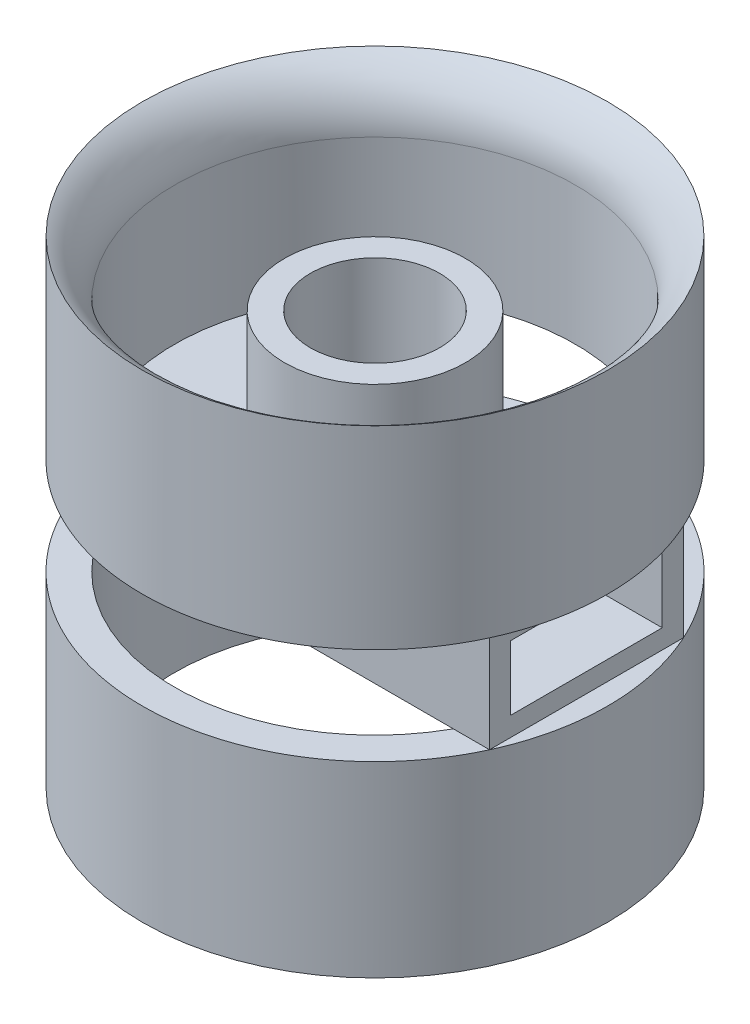
ISO-10303-21;
HEADER;
FILE_DESCRIPTION(('STEP AP214'),'2;1');
FILE_NAME('part.step','',(''),(''),'','','');
FILE_SCHEMA(('AUTOMOTIVE_DESIGN { 1 0 10303 214 1 1 1 1 }'));
ENDSEC;
DATA;
#1=APPLICATION_CONTEXT('core data for automotive mechanical design processes');
#2=APPLICATION_PROTOCOL_DEFINITION('international standard','automotive_design',2000,#1);
#3=PRODUCT_CONTEXT('',#1,'mechanical');
#4=PRODUCT('Part','Part','',(#3));
#5=PRODUCT_RELATED_PRODUCT_CATEGORY('part','',(#4));
#6=PRODUCT_DEFINITION_FORMATION('','',#4);
#7=PRODUCT_DEFINITION_CONTEXT('part definition',#1,'design');
#8=PRODUCT_DEFINITION('design','',#6,#7);
#9=PRODUCT_DEFINITION_SHAPE('','',#8);
#10=(LENGTH_UNIT() NAMED_UNIT(*) SI_UNIT(.MILLI.,.METRE.));
#11=(NAMED_UNIT(*) PLANE_ANGLE_UNIT() SI_UNIT($,.RADIAN.));
#12=(NAMED_UNIT(*) SI_UNIT($,.STERADIAN.) SOLID_ANGLE_UNIT());
#13=UNCERTAINTY_MEASURE_WITH_UNIT(LENGTH_MEASURE(1.E-05),#10,'distance_accuracy_value','');
#14=(GEOMETRIC_REPRESENTATION_CONTEXT(3) GLOBAL_UNCERTAINTY_ASSIGNED_CONTEXT((#13)) GLOBAL_UNIT_ASSIGNED_CONTEXT((#10,
#11,#12)) REPRESENTATION_CONTEXT('',''));
#15=CARTESIAN_POINT('',(0.,0.,0.));
#16=DIRECTION('',(0.,0.,1.));
#17=DIRECTION('',(1.,0.,0.));
#18=AXIS2_PLACEMENT_3D('',#15,#16,#17);
#19=CARTESIAN_POINT('',(0.,30.,0.));
#20=DIRECTION('',(0.,-1.,0.));
#21=DIRECTION('',(0.,0.,-1.));
#22=AXIS2_PLACEMENT_3D('',#19,#20,#21);
#23=CYLINDRICAL_SURFACE('',#22,36.);
#24=CARTESIAN_POINT('',(0.,30.,0.));
#25=DIRECTION('',(0.,1.,0.));
#26=DIRECTION('',(0.,0.,1.));
#27=AXIS2_PLACEMENT_3D('',#24,#25,#26);
#28=CIRCLE('',#27,36.);
#29=CARTESIAN_POINT('',(0.,30.,36.));
#30=VERTEX_POINT('',#29);
#31=EDGE_CURVE('E228',#30,#30,#28,.T.);
#32=ORIENTED_EDGE('',*,*,#31,.F.);
#33=EDGE_LOOP('',(#32));
#34=FACE_BOUND('',#33,.T.);
#35=CARTESIAN_POINT('',(0.,0.,0.));
#36=DIRECTION('',(0.,1.,0.));
#37=DIRECTION('',(0.,0.,1.));
#38=AXIS2_PLACEMENT_3D('',#35,#36,#37);
#39=CIRCLE('',#38,36.);
#40=CARTESIAN_POINT('',(0.,0.,36.));
#41=VERTEX_POINT('',#40);
#42=EDGE_CURVE('E226',#41,#41,#39,.T.);
#43=ORIENTED_EDGE('',*,*,#42,.T.);
#44=EDGE_LOOP('',(#43));
#45=FACE_BOUND('',#44,.T.);
#46=ADVANCED_FACE('F33',(#34,#45),#23,.T.);
#47=CARTESIAN_POINT('',(0.,0.,0.));
#48=DIRECTION('',(0.,1.,0.));
#49=DIRECTION('',(0.,0.,1.));
#50=AXIS2_PLACEMENT_3D('',#47,#48,#49);
#51=PLANE('',#50);
#52=CARTESIAN_POINT('',(0.,0.,0.));
#53=DIRECTION('',(0.,1.,0.));
#54=DIRECTION('',(0.,0.,1.));
#55=AXIS2_PLACEMENT_3D('',#52,#53,#54);
#56=CIRCLE('',#55,31.);
#57=CARTESIAN_POINT('',(27.1293199325011,0.,-15.));
#58=VERTEX_POINT('',#57);
#59=CARTESIAN_POINT('',(-27.1293199325011,0.,-15.));
#60=VERTEX_POINT('',#59);
#61=EDGE_CURVE('E227',#58,#60,#56,.T.);
#62=ORIENTED_EDGE('',*,*,#61,.T.);
#63=DIRECTION('',(-1.,0.,0.));
#64=VECTOR('',#63,1.);
#65=CARTESIAN_POINT('',(-32.7237421934683,0.,-15.));
#66=LINE('',#65,#64);
#67=CARTESIAN_POINT('',(-32.7237421934683,0.,-15.));
#68=VERTEX_POINT('',#67);
#69=EDGE_CURVE('E208',#60,#68,#66,.T.);
#70=ORIENTED_EDGE('',*,*,#69,.T.);
#71=DIRECTION('',(0.,0.,1.));
#72=VECTOR('',#71,1.);
#73=CARTESIAN_POINT('',(-32.7237421934683,0.,-15.));
#74=LINE('',#73,#72);
#75=CARTESIAN_POINT('',(-32.7237421934683,0.,15.));
#76=VERTEX_POINT('',#75);
#77=EDGE_CURVE('E207',#68,#76,#74,.T.);
#78=ORIENTED_EDGE('',*,*,#77,.T.);
#79=DIRECTION('',(1.,0.,0.));
#80=VECTOR('',#79,1.);
#81=CARTESIAN_POINT('',(-32.7237421934683,0.,15.));
#82=LINE('',#81,#80);
#83=CARTESIAN_POINT('',(-27.1293199325011,0.,15.));
#84=VERTEX_POINT('',#83);
#85=EDGE_CURVE('E212',#76,#84,#82,.T.);
#86=ORIENTED_EDGE('',*,*,#85,.T.);
#87=CARTESIAN_POINT('',(27.1293199325011,0.,15.));
#88=VERTEX_POINT('',#87);
#89=EDGE_CURVE('E218',#84,#88,#56,.T.);
#90=ORIENTED_EDGE('',*,*,#89,.T.);
#91=CARTESIAN_POINT('',(32.7237421934683,0.,15.));
#92=VERTEX_POINT('',#91);
#93=EDGE_CURVE('E215',#88,#92,#82,.T.);
#94=ORIENTED_EDGE('',*,*,#93,.T.);
#95=DIRECTION('',(0.,0.,-1.));
#96=VECTOR('',#95,1.);
#97=CARTESIAN_POINT('',(32.7237421934683,0.,-15.));
#98=LINE('',#97,#96);
#99=CARTESIAN_POINT('',(32.7237421934683,0.,-15.));
#100=VERTEX_POINT('',#99);
#101=EDGE_CURVE('E199',#92,#100,#98,.T.);
#102=ORIENTED_EDGE('',*,*,#101,.T.);
#103=EDGE_CURVE('E204',#100,#58,#66,.T.);
#104=ORIENTED_EDGE('',*,*,#103,.T.);
#105=EDGE_LOOP('',(#62,#70,#78,#86,#90,#94,#102,#104));
#106=FACE_BOUND('',#105,.T.);
#107=ORIENTED_EDGE('',*,*,#42,.F.);
#108=EDGE_LOOP('',(#107));
#109=FACE_BOUND('',#108,.T.);
#110=ADVANCED_FACE('F251',(#106,#109),#51,.F.);
#111=CARTESIAN_POINT('',(0.,0.,0.));
#112=DIRECTION('',(0.,1.,0.));
#113=DIRECTION('',(0.,0.,1.));
#114=AXIS2_PLACEMENT_3D('',#111,#112,#113);
#115=CYLINDRICAL_SURFACE('',#114,31.);
#116=CARTESIAN_POINT('',(0.,21.3397459621556,0.));
#117=DIRECTION('',(0.,1.,0.));
#118=DIRECTION('',(0.,0.,1.));
#119=AXIS2_PLACEMENT_3D('',#116,#117,#118);
#120=CIRCLE('',#119,31.);
#121=CARTESIAN_POINT('',(0.,21.3397459621556,31.));
#122=VERTEX_POINT('',#121);
#123=EDGE_CURVE('E231',#122,#122,#120,.T.);
#124=ORIENTED_EDGE('',*,*,#123,.T.);
#125=EDGE_LOOP('',(#124));
#126=FACE_BOUND('',#125,.T.);
#127=EDGE_CURVE('E224',#88,#58,#56,.T.);
#128=ORIENTED_EDGE('',*,*,#127,.F.);
#129=ORIENTED_EDGE('',*,*,#89,.F.);
#130=EDGE_CURVE('E248',#60,#84,#56,.T.);
#131=ORIENTED_EDGE('',*,*,#130,.F.);
#132=ORIENTED_EDGE('',*,*,#61,.F.);
#133=EDGE_LOOP('',(#128,#129,#131,#132));
#134=FACE_BOUND('',#133,.T.);
#135=ADVANCED_FACE('F255',(#126,#134),#115,.F.);
#136=CARTESIAN_POINT('',(0.,21.3397459621556,0.));
#137=DIRECTION('',(0.,1.,0.));
#138=DIRECTION('',(0.,0.,1.));
#139=AXIS2_PLACEMENT_3D('',#136,#137,#138);
#140=TOROIDAL_SURFACE('',#139,41.,10.);
#141=ORIENTED_EDGE('',*,*,#31,.T.);
#142=EDGE_LOOP('',(#141));
#143=FACE_BOUND('',#142,.T.);
#144=ORIENTED_EDGE('',*,*,#123,.F.);
#145=EDGE_LOOP('',(#144));
#146=FACE_BOUND('',#145,.T.);
#147=ADVANCED_FACE('F35',(#143,#146),#140,.T.);
#148=CARTESIAN_POINT('',(32.7237421934683,-15.,-15.));
#149=DIRECTION('',(1.,0.,0.));
#150=DIRECTION('',(0.,0.,-1.));
#151=AXIS2_PLACEMENT_3D('',#148,#149,#150);
#152=PLANE('',#151);
#153=DIRECTION('',(0.,-1.,0.));
#154=VECTOR('',#153,1.);
#155=CARTESIAN_POINT('',(32.7237421934683,-15.,11.725));
#156=LINE('',#155,#154);
#157=CARTESIAN_POINT('',(32.7237421934683,-2.02034535171655,11.725));
#158=VERTEX_POINT('',#157);
#159=CARTESIAN_POINT('',(32.7237421934683,-12.0203453517165,11.725));
#160=VERTEX_POINT('',#159);
#161=EDGE_CURVE('E203',#158,#160,#156,.T.);
#162=ORIENTED_EDGE('',*,*,#161,.F.);
#163=DIRECTION('',(0.,0.,1.));
#164=VECTOR('',#163,1.);
#165=CARTESIAN_POINT('',(32.7237421934683,-2.02034535171655,-15.));
#166=LINE('',#165,#164);
#167=CARTESIAN_POINT('',(32.7237421934683,-2.02034535171655,-11.725));
#168=VERTEX_POINT('',#167);
#169=EDGE_CURVE('E279',#168,#158,#166,.T.);
#170=ORIENTED_EDGE('',*,*,#169,.F.);
#171=DIRECTION('',(0.,1.,0.));
#172=VECTOR('',#171,1.);
#173=CARTESIAN_POINT('',(32.7237421934683,-15.,-11.725));
#174=LINE('',#173,#172);
#175=CARTESIAN_POINT('',(32.7237421934683,-12.0203453517165,-11.725));
#176=VERTEX_POINT('',#175);
#177=EDGE_CURVE('E276',#176,#168,#174,.T.);
#178=ORIENTED_EDGE('',*,*,#177,.F.);
#179=DIRECTION('',(0.,0.,-1.));
#180=VECTOR('',#179,1.);
#181=CARTESIAN_POINT('',(32.7237421934683,-12.0203453517165,-15.));
#182=LINE('',#181,#180);
#183=EDGE_CURVE('E274',#160,#176,#182,.T.);
#184=ORIENTED_EDGE('',*,*,#183,.F.);
#185=EDGE_LOOP('',(#162,#170,#178,#184));
#186=FACE_BOUND('',#185,.T.);
#187=ORIENTED_EDGE('',*,*,#101,.F.);
#188=DIRECTION('',(0.,1.,0.));
#189=VECTOR('',#188,1.);
#190=CARTESIAN_POINT('',(32.7237421934683,-15.,15.));
#191=LINE('',#190,#189);
#192=CARTESIAN_POINT('',(32.7237421934683,-15.,15.));
#193=VERTEX_POINT('',#192);
#194=EDGE_CURVE('E216',#193,#92,#191,.T.);
#195=ORIENTED_EDGE('',*,*,#194,.F.);
#196=DIRECTION('',(0.,0.,-1.));
#197=VECTOR('',#196,1.);
#198=CARTESIAN_POINT('',(32.7237421934683,-15.,-15.));
#199=LINE('',#198,#197);
#200=CARTESIAN_POINT('',(32.7237421934683,-15.,-15.));
#201=VERTEX_POINT('',#200);
#202=EDGE_CURVE('E185',#193,#201,#199,.T.);
#203=ORIENTED_EDGE('',*,*,#202,.T.);
#204=DIRECTION('',(0.,1.,0.));
#205=VECTOR('',#204,1.);
#206=CARTESIAN_POINT('',(32.7237421934683,-15.,-15.));
#207=LINE('',#206,#205);
#208=EDGE_CURVE('E195',#201,#100,#207,.T.);
#209=ORIENTED_EDGE('',*,*,#208,.T.);
#210=EDGE_LOOP('',(#187,#195,#203,#209));
#211=FACE_BOUND('',#210,.T.);
#212=ADVANCED_FACE('F413',(#186,#211),#152,.T.);
#213=CARTESIAN_POINT('',(-32.7237421934683,-15.,15.));
#214=DIRECTION('',(0.,0.,1.));
#215=DIRECTION('',(1.,0.,0.));
#216=AXIS2_PLACEMENT_3D('',#213,#214,#215);
#217=PLANE('',#216);
#218=ORIENTED_EDGE('',*,*,#85,.F.);
#219=DIRECTION('',(0.,1.,0.));
#220=VECTOR('',#219,1.);
#221=CARTESIAN_POINT('',(-32.7237421934683,-15.,15.));
#222=LINE('',#221,#220);
#223=CARTESIAN_POINT('',(-32.7237421934683,-15.,15.));
#224=VERTEX_POINT('',#223);
#225=EDGE_CURVE('E219',#224,#76,#222,.T.);
#226=ORIENTED_EDGE('',*,*,#225,.F.);
#227=DIRECTION('',(1.,0.,0.));
#228=VECTOR('',#227,1.);
#229=CARTESIAN_POINT('',(-32.7237421934683,-15.,15.));
#230=LINE('',#229,#228);
#231=CARTESIAN_POINT('',(-27.1293199325011,-15.,15.));
#232=VERTEX_POINT('',#231);
#233=EDGE_CURVE('E191',#224,#232,#230,.T.);
#234=ORIENTED_EDGE('',*,*,#233,.T.);
#235=CARTESIAN_POINT('',(27.1293199325011,-15.,15.));
#236=VERTEX_POINT('',#235);
#237=EDGE_CURVE('E174',#232,#236,#230,.T.);
#238=ORIENTED_EDGE('',*,*,#237,.T.);
#239=EDGE_CURVE('E181',#236,#193,#230,.T.);
#240=ORIENTED_EDGE('',*,*,#239,.T.);
#241=ORIENTED_EDGE('',*,*,#194,.T.);
#242=ORIENTED_EDGE('',*,*,#93,.F.);
#243=EDGE_CURVE('E211',#84,#88,#82,.T.);
#244=ORIENTED_EDGE('',*,*,#243,.F.);
#245=EDGE_LOOP('',(#218,#226,#234,#238,#240,#241,#242,#244));
#246=FACE_BOUND('',#245,.T.);
#247=ADVANCED_FACE('F193',(#246),#217,.T.);
#248=CARTESIAN_POINT('',(-32.7237421934683,-15.,-15.));
#249=DIRECTION('',(-1.,0.,0.));
#250=DIRECTION('',(0.,0.,1.));
#251=AXIS2_PLACEMENT_3D('',#248,#249,#250);
#252=PLANE('',#251);
#253=DIRECTION('',(0.,0.,1.));
#254=VECTOR('',#253,1.);
#255=CARTESIAN_POINT('',(-32.7237421934683,-7.62470345040307,-12.7250000000174));
#256=LINE('',#255,#254);
#257=CARTESIAN_POINT('',(-32.7237421934683,-7.62470345040307,-12.7250000000174));
#258=VERTEX_POINT('',#257);
#259=CARTESIAN_POINT('',(-32.7237421934683,-7.62470345040307,-11.7250000000063));
#260=VERTEX_POINT('',#259);
#261=EDGE_CURVE('E321',#258,#260,#256,.T.);
#262=ORIENTED_EDGE('',*,*,#261,.F.);
#263=DIRECTION('',(0.,1.,0.));
#264=VECTOR('',#263,1.);
#265=CARTESIAN_POINT('',(-32.7237421934683,-8.62483976210394,-12.7250000000174));
#266=LINE('',#265,#264);
#267=CARTESIAN_POINT('',(-32.7237421934683,-8.62483976210394,-12.7250000000174));
#268=VERTEX_POINT('',#267);
#269=EDGE_CURVE('E324',#268,#258,#266,.T.);
#270=ORIENTED_EDGE('',*,*,#269,.F.);
#271=DIRECTION('',(0.,0.,1.));
#272=VECTOR('',#271,1.);
#273=CARTESIAN_POINT('',(-32.7237421934683,-8.62483976210394,-13.7250000000174));
#274=LINE('',#273,#272);
#275=CARTESIAN_POINT('',(-32.7237421934683,-8.62483976210394,-13.7250000000174));
#276=VERTEX_POINT('',#275);
#277=EDGE_CURVE('E327',#276,#268,#274,.T.);
#278=ORIENTED_EDGE('',*,*,#277,.F.);
#279=DIRECTION('',(0.,-1.,0.));
#280=VECTOR('',#279,1.);
#281=CARTESIAN_POINT('',(-32.7237421934683,-5.62470345040308,-13.7250000000174));
#282=LINE('',#281,#280);
#283=CARTESIAN_POINT('',(-32.7237421934683,-5.62470345040308,-13.7250000000174));
#284=VERTEX_POINT('',#283);
#285=EDGE_CURVE('E330',#284,#276,#282,.T.);
#286=ORIENTED_EDGE('',*,*,#285,.F.);
#287=DIRECTION('',(0.,0.,-1.));
#288=VECTOR('',#287,1.);
#289=CARTESIAN_POINT('',(-32.7237421934683,-5.62470345040308,-12.7250000000174));
#290=LINE('',#289,#288);
#291=CARTESIAN_POINT('',(-32.7237421934683,-5.62470345040308,-12.7250000000174));
#292=VERTEX_POINT('',#291);
#293=EDGE_CURVE('E333',#292,#284,#290,.T.);
#294=ORIENTED_EDGE('',*,*,#293,.F.);
#295=DIRECTION('',(0.,1.,0.));
#296=VECTOR('',#295,1.);
#297=CARTESIAN_POINT('',(-32.7237421934683,-6.62470345040308,-12.7250000000174));
#298=LINE('',#297,#296);
#299=CARTESIAN_POINT('',(-32.7237421934683,-6.62470345040308,-12.7250000000174));
#300=VERTEX_POINT('',#299);
#301=EDGE_CURVE('E336',#300,#292,#298,.T.);
#302=ORIENTED_EDGE('',*,*,#301,.F.);
#303=DIRECTION('',(0.,0.,-1.));
#304=VECTOR('',#303,1.);
#305=CARTESIAN_POINT('',(-32.7237421934683,-6.62470345040308,-11.7250000000063));
#306=LINE('',#305,#304);
#307=CARTESIAN_POINT('',(-32.7237421934683,-6.62470345040308,-11.7250000000063));
#308=VERTEX_POINT('',#307);
#309=EDGE_CURVE('E339',#308,#300,#306,.T.);
#310=ORIENTED_EDGE('',*,*,#309,.F.);
#311=DIRECTION('',(0.,-1.,0.));
#312=VECTOR('',#311,1.);
#313=CARTESIAN_POINT('',(-32.7237421934683,-2.02034535171655,-11.725));
#314=LINE('',#313,#312);
#315=CARTESIAN_POINT('',(-32.7237421934683,-2.02034535171655,-11.725));
#316=VERTEX_POINT('',#315);
#317=EDGE_CURVE('E294',#316,#308,#314,.T.);
#318=ORIENTED_EDGE('',*,*,#317,.F.);
#319=DIRECTION('',(0.,0.,-1.));
#320=VECTOR('',#319,1.);
#321=CARTESIAN_POINT('',(-32.7237421934683,-2.02034535171655,-11.725));
#322=LINE('',#321,#320);
#323=CARTESIAN_POINT('',(-32.7237421934683,-2.02034535171655,11.725));
#324=VERTEX_POINT('',#323);
#325=EDGE_CURVE('E298',#324,#316,#322,.T.);
#326=ORIENTED_EDGE('',*,*,#325,.F.);
#327=DIRECTION('',(0.,1.,0.));
#328=VECTOR('',#327,1.);
#329=CARTESIAN_POINT('',(-32.7237421934683,-2.02034535171655,11.725));
#330=LINE('',#329,#328);
#331=CARTESIAN_POINT('',(-32.7237421934683,-12.0203453517165,11.725));
#332=VERTEX_POINT('',#331);
#333=EDGE_CURVE('E301',#332,#324,#330,.T.);
#334=ORIENTED_EDGE('',*,*,#333,.F.);
#335=DIRECTION('',(0.,0.,1.));
#336=VECTOR('',#335,1.);
#337=CARTESIAN_POINT('',(-32.7237421934683,-12.0203453517165,-11.725));
#338=LINE('',#337,#336);
#339=CARTESIAN_POINT('',(-32.7237421934683,-12.0203453517165,-11.725));
#340=VERTEX_POINT('',#339);
#341=EDGE_CURVE('E286',#340,#332,#338,.T.);
#342=ORIENTED_EDGE('',*,*,#341,.F.);
#343=EDGE_CURVE('E297',#260,#340,#314,.T.);
#344=ORIENTED_EDGE('',*,*,#343,.F.);
#345=EDGE_LOOP('',(#262,#270,#278,#286,#294,#302,#310,#318,#326,#334,#342,#344));
#346=FACE_BOUND('',#345,.T.);
#347=ORIENTED_EDGE('',*,*,#77,.F.);
#348=DIRECTION('',(0.,1.,0.));
#349=VECTOR('',#348,1.);
#350=CARTESIAN_POINT('',(-32.7237421934683,-15.,-15.));
#351=LINE('',#350,#349);
#352=CARTESIAN_POINT('',(-32.7237421934683,-15.,-15.));
#353=VERTEX_POINT('',#352);
#354=EDGE_CURVE('E221',#353,#68,#351,.T.);
#355=ORIENTED_EDGE('',*,*,#354,.F.);
#356=DIRECTION('',(0.,0.,1.));
#357=VECTOR('',#356,1.);
#358=CARTESIAN_POINT('',(-32.7237421934683,-15.,-15.));
#359=LINE('',#358,#357);
#360=EDGE_CURVE('E189',#353,#224,#359,.T.);
#361=ORIENTED_EDGE('',*,*,#360,.T.);
#362=ORIENTED_EDGE('',*,*,#225,.T.);
#363=EDGE_LOOP('',(#347,#355,#361,#362));
#364=FACE_BOUND('',#363,.T.);
#365=ADVANCED_FACE('F268',(#346,#364),#252,.T.);
#366=CARTESIAN_POINT('',(-32.7237421934683,-15.,-15.));
#367=DIRECTION('',(0.,0.,-1.));
#368=DIRECTION('',(-1.,0.,0.));
#369=AXIS2_PLACEMENT_3D('',#366,#367,#368);
#370=PLANE('',#369);
#371=ORIENTED_EDGE('',*,*,#103,.F.);
#372=ORIENTED_EDGE('',*,*,#208,.F.);
#373=DIRECTION('',(-1.,0.,0.));
#374=VECTOR('',#373,1.);
#375=CARTESIAN_POINT('',(-32.7237421934683,-15.,-15.));
#376=LINE('',#375,#374);
#377=CARTESIAN_POINT('',(27.1293199325011,-15.,-15.));
#378=VERTEX_POINT('',#377);
#379=EDGE_CURVE('E269',#201,#378,#376,.T.);
#380=ORIENTED_EDGE('',*,*,#379,.T.);
#381=CARTESIAN_POINT('',(-27.1293199325011,-15.,-15.));
#382=VERTEX_POINT('',#381);
#383=EDGE_CURVE('E176',#378,#382,#376,.T.);
#384=ORIENTED_EDGE('',*,*,#383,.T.);
#385=EDGE_CURVE('E264',#382,#353,#376,.T.);
#386=ORIENTED_EDGE('',*,*,#385,.T.);
#387=ORIENTED_EDGE('',*,*,#354,.T.);
#388=ORIENTED_EDGE('',*,*,#69,.F.);
#389=EDGE_CURVE('E202',#58,#60,#66,.T.);
#390=ORIENTED_EDGE('',*,*,#389,.F.);
#391=EDGE_LOOP('',(#371,#372,#380,#384,#386,#387,#388,#390));
#392=FACE_BOUND('',#391,.T.);
#393=ADVANCED_FACE('F259',(#392),#370,.T.);
#394=CARTESIAN_POINT('',(0.,0.,0.));
#395=DIRECTION('',(0.,1.,0.));
#396=DIRECTION('',(0.,0.,1.));
#397=AXIS2_PLACEMENT_3D('',#394,#395,#396);
#398=PLANE('',#397);
#399=CARTESIAN_POINT('',(0.,0.,0.));
#400=DIRECTION('',(0.,1.,0.));
#401=DIRECTION('',(0.,0.,1.));
#402=AXIS2_PLACEMENT_3D('',#399,#400,#401);
#403=CIRCLE('',#402,14.);
#404=CARTESIAN_POINT('',(0.,0.,14.));
#405=VERTEX_POINT('',#404);
#406=EDGE_CURVE('E364',#405,#405,#403,.T.);
#407=ORIENTED_EDGE('',*,*,#406,.F.);
#408=EDGE_LOOP('',(#407));
#409=FACE_BOUND('',#408,.T.);
#410=ORIENTED_EDGE('',*,*,#243,.T.);
#411=ORIENTED_EDGE('',*,*,#127,.T.);
#412=ORIENTED_EDGE('',*,*,#389,.T.);
#413=ORIENTED_EDGE('',*,*,#130,.T.);
#414=EDGE_LOOP('',(#410,#411,#412,#413));
#415=FACE_BOUND('',#414,.T.);
#416=ADVANCED_FACE('F243',(#409,#415),#398,.T.);
#417=CARTESIAN_POINT('',(36.,-2.02034535171655,11.725));
#418=DIRECTION('',(0.,0.,1.));
#419=DIRECTION('',(1.,0.,0.));
#420=AXIS2_PLACEMENT_3D('',#417,#418,#419);
#421=PLANE('',#420);
#422=ORIENTED_EDGE('',*,*,#161,.T.);
#423=DIRECTION('',(-1.,0.,0.));
#424=VECTOR('',#423,1.);
#425=CARTESIAN_POINT('',(36.,-12.0203453517165,11.725));
#426=LINE('',#425,#424);
#427=EDGE_CURVE('E281',#160,#332,#426,.T.);
#428=ORIENTED_EDGE('',*,*,#427,.T.);
#429=ORIENTED_EDGE('',*,*,#333,.T.);
#430=DIRECTION('',(-1.,0.,0.));
#431=VECTOR('',#430,1.);
#432=CARTESIAN_POINT('',(36.,-2.02034535171655,11.725));
#433=LINE('',#432,#431);
#434=EDGE_CURVE('E282',#158,#324,#433,.T.);
#435=ORIENTED_EDGE('',*,*,#434,.F.);
#436=EDGE_LOOP('',(#422,#428,#429,#435));
#437=FACE_BOUND('',#436,.T.);
#438=ADVANCED_FACE('F426',(#437),#421,.F.);
#439=CARTESIAN_POINT('',(36.,-12.0203453517165,-11.725));
#440=DIRECTION('',(0.,-1.,0.));
#441=DIRECTION('',(0.,0.,-1.));
#442=AXIS2_PLACEMENT_3D('',#439,#440,#441);
#443=PLANE('',#442);
#444=ORIENTED_EDGE('',*,*,#183,.T.);
#445=DIRECTION('',(-1.,0.,0.));
#446=VECTOR('',#445,1.);
#447=CARTESIAN_POINT('',(36.,-12.0203453517165,-11.725));
#448=LINE('',#447,#446);
#449=EDGE_CURVE('E288',#176,#340,#448,.T.);
#450=ORIENTED_EDGE('',*,*,#449,.T.);
#451=ORIENTED_EDGE('',*,*,#341,.T.);
#452=ORIENTED_EDGE('',*,*,#427,.F.);
#453=EDGE_LOOP('',(#444,#450,#451,#452));
#454=FACE_BOUND('',#453,.T.);
#455=ADVANCED_FACE('F430',(#454),#443,.F.);
#456=CARTESIAN_POINT('',(36.,-2.02034535171655,-11.725));
#457=DIRECTION('',(0.,0.,-1.));
#458=DIRECTION('',(-1.,0.,0.));
#459=AXIS2_PLACEMENT_3D('',#456,#457,#458);
#460=PLANE('',#459);
#461=DIRECTION('',(0.,1.,0.));
#462=VECTOR('',#461,1.);
#463=CARTESIAN_POINT('',(25.2762578065317,-7.62470345040307,-11.7250000000063));
#464=LINE('',#463,#462);
#465=CARTESIAN_POINT('',(25.2762578065317,-7.62470345040307,-11.725));
#466=VERTEX_POINT('',#465);
#467=CARTESIAN_POINT('',(25.2762578065317,-6.62470345040308,-11.7250000000063));
#468=VERTEX_POINT('',#467);
#469=EDGE_CURVE('E323',#466,#468,#464,.T.);
#470=ORIENTED_EDGE('',*,*,#469,.F.);
#471=DIRECTION('',(-1.,0.,0.));
#472=VECTOR('',#471,1.);
#473=CARTESIAN_POINT('',(25.2762578065317,-7.62470345040307,-11.7250000000063));
#474=LINE('',#473,#472);
#475=EDGE_CURVE('E303',#466,#260,#474,.T.);
#476=ORIENTED_EDGE('',*,*,#475,.T.);
#477=ORIENTED_EDGE('',*,*,#343,.T.);
#478=ORIENTED_EDGE('',*,*,#449,.F.);
#479=ORIENTED_EDGE('',*,*,#177,.T.);
#480=DIRECTION('',(-1.,0.,0.));
#481=VECTOR('',#480,1.);
#482=CARTESIAN_POINT('',(36.,-2.02034535171655,-11.725));
#483=LINE('',#482,#481);
#484=EDGE_CURVE('E285',#168,#316,#483,.T.);
#485=ORIENTED_EDGE('',*,*,#484,.T.);
#486=ORIENTED_EDGE('',*,*,#317,.T.);
#487=DIRECTION('',(-1.,0.,0.));
#488=VECTOR('',#487,1.);
#489=CARTESIAN_POINT('',(25.2762578065317,-6.62470345040308,-11.7250000000063));
#490=LINE('',#489,#488);
#491=EDGE_CURVE('E304',#468,#308,#490,.T.);
#492=ORIENTED_EDGE('',*,*,#491,.F.);
#493=EDGE_LOOP('',(#470,#476,#477,#478,#479,#485,#486,#492));
#494=FACE_BOUND('',#493,.T.);
#495=ADVANCED_FACE('F436',(#494),#460,.F.);
#496=CARTESIAN_POINT('',(36.,-2.02034535171655,-11.725));
#497=DIRECTION('',(0.,1.,0.));
#498=DIRECTION('',(0.,0.,1.));
#499=AXIS2_PLACEMENT_3D('',#496,#497,#498);
#500=PLANE('',#499);
#501=ORIENTED_EDGE('',*,*,#169,.T.);
#502=ORIENTED_EDGE('',*,*,#434,.T.);
#503=ORIENTED_EDGE('',*,*,#325,.T.);
#504=ORIENTED_EDGE('',*,*,#484,.F.);
#505=EDGE_LOOP('',(#501,#502,#503,#504));
#506=FACE_BOUND('',#505,.T.);
#507=ADVANCED_FACE('F432',(#506),#500,.F.);
#508=CARTESIAN_POINT('',(25.2762578065317,-7.62470345040307,-12.7250000000174));
#509=DIRECTION('',(0.,-1.,0.));
#510=DIRECTION('',(0.,0.,-1.));
#511=AXIS2_PLACEMENT_3D('',#508,#509,#510);
#512=PLANE('',#511);
#513=ORIENTED_EDGE('',*,*,#261,.T.);
#514=ORIENTED_EDGE('',*,*,#475,.F.);
#515=DIRECTION('',(0.,0.,1.));
#516=VECTOR('',#515,1.);
#517=CARTESIAN_POINT('',(25.2762578065317,-7.62470345040307,-12.7250000000174));
#518=LINE('',#517,#516);
#519=CARTESIAN_POINT('',(25.2762578065317,-7.62470345040307,-12.7250000000174));
#520=VERTEX_POINT('',#519);
#521=EDGE_CURVE('E307',#520,#466,#518,.T.);
#522=ORIENTED_EDGE('',*,*,#521,.F.);
#523=DIRECTION('',(-1.,0.,0.));
#524=VECTOR('',#523,1.);
#525=CARTESIAN_POINT('',(25.2762578065317,-7.62470345040307,-12.7250000000174));
#526=LINE('',#525,#524);
#527=EDGE_CURVE('E317',#520,#258,#526,.T.);
#528=ORIENTED_EDGE('',*,*,#527,.T.);
#529=EDGE_LOOP('',(#513,#514,#522,#528));
#530=FACE_BOUND('',#529,.T.);
#531=ADVANCED_FACE('F435',(#530),#512,.F.);
#532=CARTESIAN_POINT('',(25.2762578065317,-8.62483976210394,-12.7250000000174));
#533=DIRECTION('',(0.,0.,1.));
#534=DIRECTION('',(1.,0.,0.));
#535=AXIS2_PLACEMENT_3D('',#532,#533,#534);
#536=PLANE('',#535);
#537=ORIENTED_EDGE('',*,*,#269,.T.);
#538=ORIENTED_EDGE('',*,*,#527,.F.);
#539=DIRECTION('',(0.,1.,0.));
#540=VECTOR('',#539,1.);
#541=CARTESIAN_POINT('',(25.2762578065317,-8.62483976210394,-12.7250000000174));
#542=LINE('',#541,#540);
#543=CARTESIAN_POINT('',(25.2762578065317,-8.62483976210394,-12.7250000000174));
#544=VERTEX_POINT('',#543);
#545=EDGE_CURVE('E344',#544,#520,#542,.T.);
#546=ORIENTED_EDGE('',*,*,#545,.F.);
#547=DIRECTION('',(-1.,0.,0.));
#548=VECTOR('',#547,1.);
#549=CARTESIAN_POINT('',(25.2762578065317,-8.62483976210394,-12.7250000000174));
#550=LINE('',#549,#548);
#551=EDGE_CURVE('E315',#544,#268,#550,.T.);
#552=ORIENTED_EDGE('',*,*,#551,.T.);
#553=EDGE_LOOP('',(#537,#538,#546,#552));
#554=FACE_BOUND('',#553,.T.);
#555=ADVANCED_FACE('F464',(#554),#536,.F.);
#556=CARTESIAN_POINT('',(25.2762578065317,-8.62483976210394,-13.7250000000174));
#557=DIRECTION('',(0.,-1.,0.));
#558=DIRECTION('',(0.,0.,-1.));
#559=AXIS2_PLACEMENT_3D('',#556,#557,#558);
#560=PLANE('',#559);
#561=ORIENTED_EDGE('',*,*,#277,.T.);
#562=ORIENTED_EDGE('',*,*,#551,.F.);
#563=DIRECTION('',(0.,0.,1.));
#564=VECTOR('',#563,1.);
#565=CARTESIAN_POINT('',(25.2762578065317,-8.62483976210394,-13.7250000000174));
#566=LINE('',#565,#564);
#567=CARTESIAN_POINT('',(25.2762578065317,-8.62483976210394,-13.7250000000174));
#568=VERTEX_POINT('',#567);
#569=EDGE_CURVE('E347',#568,#544,#566,.T.);
#570=ORIENTED_EDGE('',*,*,#569,.F.);
#571=DIRECTION('',(-1.,0.,0.));
#572=VECTOR('',#571,1.);
#573=CARTESIAN_POINT('',(25.2762578065317,-8.62483976210394,-13.7250000000174));
#574=LINE('',#573,#572);
#575=EDGE_CURVE('E313',#568,#276,#574,.T.);
#576=ORIENTED_EDGE('',*,*,#575,.T.);
#577=EDGE_LOOP('',(#561,#562,#570,#576));
#578=FACE_BOUND('',#577,.T.);
#579=ADVANCED_FACE('F460',(#578),#560,.F.);
#580=CARTESIAN_POINT('',(25.2762578065317,-5.62470345040308,-13.7250000000174));
#581=DIRECTION('',(0.,0.,-1.));
#582=DIRECTION('',(-1.,0.,0.));
#583=AXIS2_PLACEMENT_3D('',#580,#581,#582);
#584=PLANE('',#583);
#585=ORIENTED_EDGE('',*,*,#285,.T.);
#586=ORIENTED_EDGE('',*,*,#575,.F.);
#587=DIRECTION('',(0.,-1.,0.));
#588=VECTOR('',#587,1.);
#589=CARTESIAN_POINT('',(25.2762578065317,-5.62470345040308,-13.7250000000174));
#590=LINE('',#589,#588);
#591=CARTESIAN_POINT('',(25.2762578065317,-5.62470345040308,-13.7250000000174));
#592=VERTEX_POINT('',#591);
#593=EDGE_CURVE('E350',#592,#568,#590,.T.);
#594=ORIENTED_EDGE('',*,*,#593,.F.);
#595=DIRECTION('',(-1.,0.,0.));
#596=VECTOR('',#595,1.);
#597=CARTESIAN_POINT('',(25.2762578065317,-5.62470345040308,-13.7250000000174));
#598=LINE('',#597,#596);
#599=EDGE_CURVE('E311',#592,#284,#598,.T.);
#600=ORIENTED_EDGE('',*,*,#599,.T.);
#601=EDGE_LOOP('',(#585,#586,#594,#600));
#602=FACE_BOUND('',#601,.T.);
#603=ADVANCED_FACE('F456',(#602),#584,.F.);
#604=CARTESIAN_POINT('',(25.2762578065317,-5.62470345040308,-12.7250000000174));
#605=DIRECTION('',(0.,1.,0.));
#606=DIRECTION('',(0.,0.,1.));
#607=AXIS2_PLACEMENT_3D('',#604,#605,#606);
#608=PLANE('',#607);
#609=ORIENTED_EDGE('',*,*,#293,.T.);
#610=ORIENTED_EDGE('',*,*,#599,.F.);
#611=DIRECTION('',(0.,0.,-1.));
#612=VECTOR('',#611,1.);
#613=CARTESIAN_POINT('',(25.2762578065317,-5.62470345040308,-12.7250000000174));
#614=LINE('',#613,#612);
#615=CARTESIAN_POINT('',(25.2762578065317,-5.62470345040308,-12.7250000000174));
#616=VERTEX_POINT('',#615);
#617=EDGE_CURVE('E353',#616,#592,#614,.T.);
#618=ORIENTED_EDGE('',*,*,#617,.F.);
#619=DIRECTION('',(-1.,0.,0.));
#620=VECTOR('',#619,1.);
#621=CARTESIAN_POINT('',(25.2762578065317,-5.62470345040308,-12.7250000000174));
#622=LINE('',#621,#620);
#623=EDGE_CURVE('E309',#616,#292,#622,.T.);
#624=ORIENTED_EDGE('',*,*,#623,.T.);
#625=EDGE_LOOP('',(#609,#610,#618,#624));
#626=FACE_BOUND('',#625,.T.);
#627=ADVANCED_FACE('F452',(#626),#608,.F.);
#628=CARTESIAN_POINT('',(25.2762578065317,-6.62470345040308,-12.7250000000174));
#629=DIRECTION('',(0.,0.,1.));
#630=DIRECTION('',(1.,0.,0.));
#631=AXIS2_PLACEMENT_3D('',#628,#629,#630);
#632=PLANE('',#631);
#633=ORIENTED_EDGE('',*,*,#301,.T.);
#634=ORIENTED_EDGE('',*,*,#623,.F.);
#635=DIRECTION('',(0.,1.,0.));
#636=VECTOR('',#635,1.);
#637=CARTESIAN_POINT('',(25.2762578065317,-6.62470345040308,-12.7250000000174));
#638=LINE('',#637,#636);
#639=CARTESIAN_POINT('',(25.2762578065317,-6.62470345040308,-12.7250000000174));
#640=VERTEX_POINT('',#639);
#641=EDGE_CURVE('E356',#640,#616,#638,.T.);
#642=ORIENTED_EDGE('',*,*,#641,.F.);
#643=DIRECTION('',(-1.,0.,0.));
#644=VECTOR('',#643,1.);
#645=CARTESIAN_POINT('',(25.2762578065317,-6.62470345040308,-12.7250000000174));
#646=LINE('',#645,#644);
#647=EDGE_CURVE('E306',#640,#300,#646,.T.);
#648=ORIENTED_EDGE('',*,*,#647,.T.);
#649=EDGE_LOOP('',(#633,#634,#642,#648));
#650=FACE_BOUND('',#649,.T.);
#651=ADVANCED_FACE('F448',(#650),#632,.F.);
#652=CARTESIAN_POINT('',(25.2762578065317,-6.62470345040308,-11.7250000000063));
#653=DIRECTION('',(0.,1.,0.));
#654=DIRECTION('',(0.,0.,1.));
#655=AXIS2_PLACEMENT_3D('',#652,#653,#654);
#656=PLANE('',#655);
#657=ORIENTED_EDGE('',*,*,#309,.T.);
#658=ORIENTED_EDGE('',*,*,#647,.F.);
#659=DIRECTION('',(0.,0.,-1.));
#660=VECTOR('',#659,1.);
#661=CARTESIAN_POINT('',(25.2762578065317,-6.62470345040308,-11.7250000000063));
#662=LINE('',#661,#660);
#663=EDGE_CURVE('E359',#468,#640,#662,.T.);
#664=ORIENTED_EDGE('',*,*,#663,.F.);
#665=ORIENTED_EDGE('',*,*,#491,.T.);
#666=EDGE_LOOP('',(#657,#658,#664,#665));
#667=FACE_BOUND('',#666,.T.);
#668=ADVANCED_FACE('F444',(#667),#656,.F.);
#669=CARTESIAN_POINT('',(25.2762578065317,0.,0.));
#670=DIRECTION('',(-1.,0.,0.));
#671=DIRECTION('',(0.,0.,1.));
#672=AXIS2_PLACEMENT_3D('',#669,#670,#671);
#673=PLANE('',#672);
#674=ORIENTED_EDGE('',*,*,#469,.T.);
#675=ORIENTED_EDGE('',*,*,#663,.T.);
#676=ORIENTED_EDGE('',*,*,#641,.T.);
#677=ORIENTED_EDGE('',*,*,#617,.T.);
#678=ORIENTED_EDGE('',*,*,#593,.T.);
#679=ORIENTED_EDGE('',*,*,#569,.T.);
#680=ORIENTED_EDGE('',*,*,#545,.T.);
#681=ORIENTED_EDGE('',*,*,#521,.T.);
#682=EDGE_LOOP('',(#674,#675,#676,#677,#678,#679,#680,#681));
#683=FACE_BOUND('',#682,.T.);
#684=ADVANCED_FACE('F447',(#683),#673,.T.);
#685=CARTESIAN_POINT('',(0.,20.,0.));
#686=DIRECTION('',(0.,-1.,0.));
#687=DIRECTION('',(0.,0.,-1.));
#688=AXIS2_PLACEMENT_3D('',#685,#686,#687);
#689=CYLINDRICAL_SURFACE('',#688,14.);
#690=CARTESIAN_POINT('',(0.,20.,0.));
#691=DIRECTION('',(0.,1.,0.));
#692=DIRECTION('',(0.,0.,1.));
#693=AXIS2_PLACEMENT_3D('',#690,#691,#692);
#694=CIRCLE('',#693,14.);
#695=CARTESIAN_POINT('',(0.,20.,14.));
#696=VERTEX_POINT('',#695);
#697=EDGE_CURVE('E342',#696,#696,#694,.T.);
#698=ORIENTED_EDGE('',*,*,#697,.F.);
#699=EDGE_LOOP('',(#698));
#700=FACE_BOUND('',#699,.T.);
#701=ORIENTED_EDGE('',*,*,#406,.T.);
#702=EDGE_LOOP('',(#701));
#703=FACE_BOUND('',#702,.T.);
#704=ADVANCED_FACE('F474',(#700,#703),#689,.T.);
#705=CARTESIAN_POINT('',(0.,20.,0.));
#706=DIRECTION('',(0.,1.,0.));
#707=DIRECTION('',(0.,0.,1.));
#708=AXIS2_PLACEMENT_3D('',#705,#706,#707);
#709=PLANE('',#708);
#710=CARTESIAN_POINT('',(0.,20.,0.));
#711=DIRECTION('',(0.,1.,0.));
#712=DIRECTION('',(0.,0.,1.));
#713=AXIS2_PLACEMENT_3D('',#710,#711,#712);
#714=CIRCLE('',#713,10.);
#715=CARTESIAN_POINT('',(0.,20.,10.));
#716=VERTEX_POINT('',#715);
#717=EDGE_CURVE('E370',#716,#716,#714,.T.);
#718=ORIENTED_EDGE('',*,*,#717,.F.);
#719=EDGE_LOOP('',(#718));
#720=FACE_BOUND('',#719,.T.);
#721=ORIENTED_EDGE('',*,*,#697,.T.);
#722=EDGE_LOOP('',(#721));
#723=FACE_BOUND('',#722,.T.);
#724=ADVANCED_FACE('F478',(#720,#723),#709,.T.);
#725=CARTESIAN_POINT('',(0.,0.,0.));
#726=DIRECTION('',(0.,1.,0.));
#727=DIRECTION('',(0.,0.,1.));
#728=AXIS2_PLACEMENT_3D('',#725,#726,#727);
#729=CYLINDRICAL_SURFACE('',#728,10.);
#730=CARTESIAN_POINT('',(0.,0.,0.));
#731=DIRECTION('',(0.,1.,0.));
#732=DIRECTION('',(0.,0.,1.));
#733=AXIS2_PLACEMENT_3D('',#730,#731,#732);
#734=CIRCLE('',#733,10.);
#735=CARTESIAN_POINT('',(0.,0.,10.));
#736=VERTEX_POINT('',#735);
#737=EDGE_CURVE('E367',#736,#736,#734,.T.);
#738=ORIENTED_EDGE('',*,*,#737,.F.);
#739=EDGE_LOOP('',(#738));
#740=FACE_BOUND('',#739,.T.);
#741=ORIENTED_EDGE('',*,*,#717,.T.);
#742=EDGE_LOOP('',(#741));
#743=FACE_BOUND('',#742,.T.);
#744=ADVANCED_FACE('F482',(#740,#743),#729,.F.);
#745=CARTESIAN_POINT('',(0.,0.,0.));
#746=DIRECTION('',(0.,1.,0.));
#747=DIRECTION('',(0.,0.,1.));
#748=AXIS2_PLACEMENT_3D('',#745,#746,#747);
#749=PLANE('',#748);
#750=ORIENTED_EDGE('',*,*,#737,.T.);
#751=EDGE_LOOP('',(#750));
#752=FACE_BOUND('',#751,.T.);
#753=ADVANCED_FACE('F393',(#752),#749,.T.);
#754=CARTESIAN_POINT('',(0.,-44.,0.));
#755=DIRECTION('',(0.,1.,0.));
#756=DIRECTION('',(0.,0.,1.));
#757=AXIS2_PLACEMENT_3D('',#754,#755,#756);
#758=CYLINDRICAL_SURFACE('',#757,36.);
#759=CARTESIAN_POINT('',(0.,-44.,0.));
#760=DIRECTION('',(0.,-1.,0.));
#761=DIRECTION('',(0.,0.,-1.));
#762=AXIS2_PLACEMENT_3D('',#759,#760,#761);
#763=CIRCLE('',#762,36.);
#764=CARTESIAN_POINT('',(0.,-44.,-36.));
#765=VERTEX_POINT('',#764);
#766=EDGE_CURVE('E373',#765,#765,#763,.T.);
#767=ORIENTED_EDGE('',*,*,#766,.F.);
#768=EDGE_LOOP('',(#767));
#769=FACE_BOUND('',#768,.T.);
#770=CARTESIAN_POINT('',(0.,-15.,0.));
#771=DIRECTION('',(0.,-1.,0.));
#772=DIRECTION('',(0.,0.,-1.));
#773=AXIS2_PLACEMENT_3D('',#770,#771,#772);
#774=CIRCLE('',#773,36.);
#775=CARTESIAN_POINT('',(0.,-15.,-36.));
#776=VERTEX_POINT('',#775);
#777=EDGE_CURVE('E178',#776,#776,#774,.T.);
#778=ORIENTED_EDGE('',*,*,#777,.T.);
#779=EDGE_LOOP('',(#778));
#780=FACE_BOUND('',#779,.T.);
#781=ADVANCED_FACE('F387',(#769,#780),#758,.T.);
#782=CARTESIAN_POINT('',(0.,-44.,0.));
#783=DIRECTION('',(0.,-1.,0.));
#784=DIRECTION('',(0.,0.,-1.));
#785=AXIS2_PLACEMENT_3D('',#782,#783,#784);
#786=PLANE('',#785);
#787=CARTESIAN_POINT('',(0.,-44.,0.));
#788=DIRECTION('',(0.,-1.,0.));
#789=DIRECTION('',(0.,0.,-1.));
#790=AXIS2_PLACEMENT_3D('',#787,#788,#789);
#791=CIRCLE('',#790,31.);
#792=CARTESIAN_POINT('',(0.,-44.,-31.));
#793=VERTEX_POINT('',#792);
#794=EDGE_CURVE('E380',#793,#793,#791,.T.);
#795=ORIENTED_EDGE('',*,*,#794,.F.);
#796=EDGE_LOOP('',(#795));
#797=FACE_BOUND('',#796,.T.);
#798=ORIENTED_EDGE('',*,*,#766,.T.);
#799=EDGE_LOOP('',(#798));
#800=FACE_BOUND('',#799,.T.);
#801=ADVANCED_FACE('F384',(#797,#800),#786,.T.);
#802=CARTESIAN_POINT('',(0.,-15.,0.));
#803=DIRECTION('',(0.,-1.,0.));
#804=DIRECTION('',(0.,0.,-1.));
#805=AXIS2_PLACEMENT_3D('',#802,#803,#804);
#806=PLANE('',#805);
#807=ORIENTED_EDGE('',*,*,#239,.F.);
#808=CARTESIAN_POINT('',(0.,-15.,0.));
#809=DIRECTION('',(0.,-1.,0.));
#810=DIRECTION('',(0.,0.,-1.));
#811=AXIS2_PLACEMENT_3D('',#808,#809,#810);
#812=CIRCLE('',#811,31.);
#813=EDGE_CURVE('E11',#236,#232,#812,.T.);
#814=ORIENTED_EDGE('',*,*,#813,.T.);
#815=ORIENTED_EDGE('',*,*,#233,.F.);
#816=ORIENTED_EDGE('',*,*,#360,.F.);
#817=ORIENTED_EDGE('',*,*,#385,.F.);
#818=EDGE_CURVE('E37',#382,#378,#812,.T.);
#819=ORIENTED_EDGE('',*,*,#818,.T.);
#820=ORIENTED_EDGE('',*,*,#379,.F.);
#821=ORIENTED_EDGE('',*,*,#202,.F.);
#822=EDGE_LOOP('',(#807,#814,#815,#816,#817,#819,#820,#821));
#823=FACE_BOUND('',#822,.T.);
#824=ORIENTED_EDGE('',*,*,#777,.F.);
#825=EDGE_LOOP('',(#824));
#826=FACE_BOUND('',#825,.T.);
#827=ADVANCED_FACE('F182',(#823,#826),#806,.F.);
#828=CARTESIAN_POINT('',(0.,-15.,0.));
#829=DIRECTION('',(0.,-1.,0.));
#830=DIRECTION('',(0.,0.,-1.));
#831=AXIS2_PLACEMENT_3D('',#828,#829,#830);
#832=CYLINDRICAL_SURFACE('',#831,31.);
#833=CARTESIAN_POINT('',(0.,-15.,0.));
#834=DIRECTION('',(0.,-1.,0.));
#835=DIRECTION('',(0.,0.,-1.));
#836=AXIS2_PLACEMENT_3D('',#833,#834,#835);
#837=CIRCLE('',#836,31.);
#838=EDGE_CURVE('E48',#378,#236,#837,.T.);
#839=ORIENTED_EDGE('',*,*,#838,.F.);
#840=ORIENTED_EDGE('',*,*,#818,.F.);
#841=EDGE_CURVE('E53',#232,#382,#837,.T.);
#842=ORIENTED_EDGE('',*,*,#841,.F.);
#843=ORIENTED_EDGE('',*,*,#813,.F.);
#844=EDGE_LOOP('',(#839,#840,#842,#843));
#845=FACE_BOUND('',#844,.T.);
#846=ORIENTED_EDGE('',*,*,#794,.T.);
#847=EDGE_LOOP('',(#846));
#848=FACE_BOUND('',#847,.T.);
#849=ADVANCED_FACE('F166',(#845,#848),#832,.F.);
#850=CARTESIAN_POINT('',(0.,-15.,0.));
#851=DIRECTION('',(0.,-1.,0.));
#852=DIRECTION('',(0.,0.,-1.));
#853=AXIS2_PLACEMENT_3D('',#850,#851,#852);
#854=PLANE('',#853);
#855=ORIENTED_EDGE('',*,*,#841,.T.);
#856=ORIENTED_EDGE('',*,*,#383,.F.);
#857=ORIENTED_EDGE('',*,*,#838,.T.);
#858=ORIENTED_EDGE('',*,*,#237,.F.);
#859=EDGE_LOOP('',(#855,#856,#857,#858));
#860=FACE_BOUND('',#859,.T.);
#861=ADVANCED_FACE('F172',(#860),#854,.T.);
#862=CLOSED_SHELL('',(#46,#110,#135,#147,#212,#247,#365,#393,#416,#438,#455,#495,#507,#531,#555,
#579,#603,#627,#651,#668,#684,#704,#724,#744,#753,#781,#801,#827,#849,#861));
#863=MANIFOLD_SOLID_BREP('B2',#862);
#864=ADVANCED_BREP_SHAPE_REPRESENTATION('',(#18,#863),#14);
#865=SHAPE_DEFINITION_REPRESENTATION(#9,#864);
ENDSEC;
END-ISO-10303-21;
